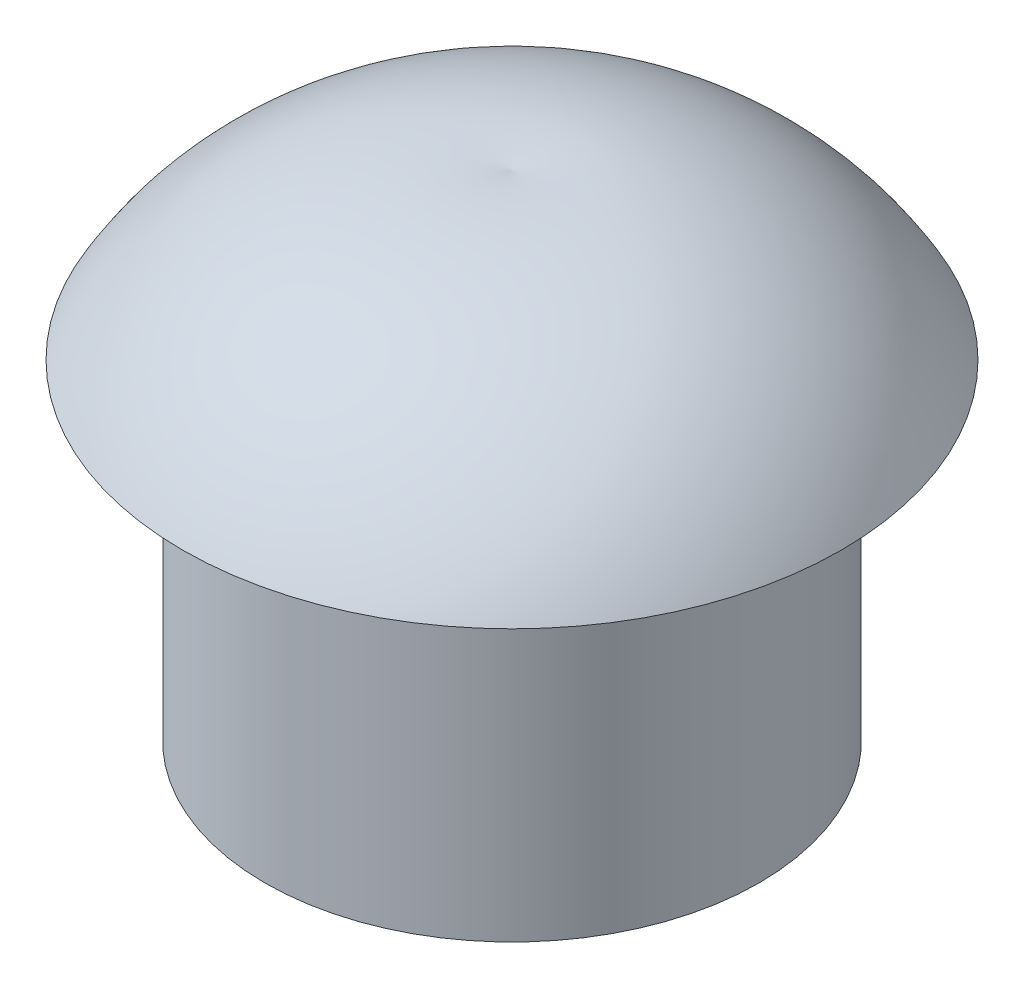
ISO-10303-21;
HEADER;
FILE_DESCRIPTION(('STEP AP214'),'2;1');
FILE_NAME('part.step','',(''),(''),'','','');
FILE_SCHEMA(('AUTOMOTIVE_DESIGN { 1 0 10303 214 1 1 1 1 }'));
ENDSEC;
DATA;
#1=APPLICATION_CONTEXT('core data for automotive mechanical design processes');
#2=APPLICATION_PROTOCOL_DEFINITION('international standard','automotive_design',2000,#1);
#3=PRODUCT_CONTEXT('',#1,'mechanical');
#4=PRODUCT('Part','Part','',(#3));
#5=PRODUCT_RELATED_PRODUCT_CATEGORY('part','',(#4));
#6=PRODUCT_DEFINITION_FORMATION('','',#4);
#7=PRODUCT_DEFINITION_CONTEXT('part definition',#1,'design');
#8=PRODUCT_DEFINITION('design','',#6,#7);
#9=PRODUCT_DEFINITION_SHAPE('','',#8);
#10=(LENGTH_UNIT() NAMED_UNIT(*) SI_UNIT(.MILLI.,.METRE.));
#11=(NAMED_UNIT(*) PLANE_ANGLE_UNIT() SI_UNIT($,.RADIAN.));
#12=(NAMED_UNIT(*) SI_UNIT($,.STERADIAN.) SOLID_ANGLE_UNIT());
#13=UNCERTAINTY_MEASURE_WITH_UNIT(LENGTH_MEASURE(1.E-05),#10,'distance_accuracy_value','');
#14=(GEOMETRIC_REPRESENTATION_CONTEXT(3) GLOBAL_UNCERTAINTY_ASSIGNED_CONTEXT((#13)) GLOBAL_UNIT_ASSIGNED_CONTEXT((#10,
#11,#12)) REPRESENTATION_CONTEXT('',''));
#15=CARTESIAN_POINT('',(0.,0.,0.));
#16=DIRECTION('',(0.,0.,1.));
#17=DIRECTION('',(1.,0.,0.));
#18=AXIS2_PLACEMENT_3D('',#15,#16,#17);
#19=CARTESIAN_POINT('',(0.,-2.,0.));
#20=DIRECTION('',(0.,1.,0.));
#21=DIRECTION('',(0.,0.,1.));
#22=AXIS2_PLACEMENT_3D('',#19,#20,#21);
#23=CYLINDRICAL_SURFACE('',#22,1.5);
#24=CARTESIAN_POINT('',(0.,-2.,0.));
#25=DIRECTION('',(0.,1.,0.));
#26=DIRECTION('',(0.,0.,1.));
#27=AXIS2_PLACEMENT_3D('',#24,#25,#26);
#28=CIRCLE('',#27,1.5);
#29=CARTESIAN_POINT('',(0.,-2.,1.5));
#30=VERTEX_POINT('',#29);
#31=EDGE_CURVE('E11',#30,#30,#28,.T.);
#32=ORIENTED_EDGE('',*,*,#31,.T.);
#33=EDGE_LOOP('',(#32));
#34=FACE_BOUND('',#33,.T.);
#35=CARTESIAN_POINT('',(0.,0.,0.));
#36=DIRECTION('',(0.,1.,0.));
#37=DIRECTION('',(0.,0.,1.));
#38=AXIS2_PLACEMENT_3D('',#35,#36,#37);
#39=CIRCLE('',#38,1.5);
#40=CARTESIAN_POINT('',(0.,0.,1.5));
#41=VERTEX_POINT('',#40);
#42=EDGE_CURVE('E37',#41,#41,#39,.T.);
#43=ORIENTED_EDGE('',*,*,#42,.F.);
#44=EDGE_LOOP('',(#43));
#45=FACE_BOUND('',#44,.T.);
#46=ADVANCED_FACE('F34',(#34,#45),#23,.T.);
#47=CARTESIAN_POINT('',(0.,-2.,0.));
#48=DIRECTION('',(0.,1.,0.));
#49=DIRECTION('',(0.,0.,1.));
#50=AXIS2_PLACEMENT_3D('',#47,#48,#49);
#51=PLANE('',#50);
#52=ORIENTED_EDGE('',*,*,#31,.F.);
#53=EDGE_LOOP('',(#52));
#54=FACE_BOUND('',#53,.T.);
#55=ADVANCED_FACE('F58',(#54),#51,.F.);
#56=CARTESIAN_POINT('',(0.,0.,0.));
#57=DIRECTION('',(0.,-1.,0.));
#58=DIRECTION('',(0.,0.,-1.));
#59=AXIS2_PLACEMENT_3D('',#56,#57,#58);
#60=PLANE('',#59);
#61=ORIENTED_EDGE('',*,*,#42,.T.);
#62=EDGE_LOOP('',(#61));
#63=FACE_BOUND('',#62,.T.);
#64=CARTESIAN_POINT('',(0.,0.,0.));
#65=DIRECTION('',(0.,-1.,0.));
#66=DIRECTION('',(0.,0.,-1.));
#67=AXIS2_PLACEMENT_3D('',#64,#65,#66);
#68=CIRCLE('',#67,2.);
#69=CARTESIAN_POINT('',(0.,0.,-2.));
#70=VERTEX_POINT('',#69);
#71=EDGE_CURVE('E50',#70,#70,#68,.T.);
#72=ORIENTED_EDGE('',*,*,#71,.T.);
#73=EDGE_LOOP('',(#72));
#74=FACE_BOUND('',#73,.T.);
#75=ADVANCED_FACE('F46',(#63,#74),#60,.T.);
#76=CARTESIAN_POINT('',(0.,-0.983239697419133,-0.258380151290434));
#77=DIRECTION('',(-1.,0.,0.));
#78=DIRECTION('',(0.,0.,-1.));
#79=AXIS2_PLACEMENT_3D('',#76,#77,#78);
#80=CIRCLE('',#79,2.);
#81=TRIMMED_CURVE('',#80,(PARAMETER_VALUE(-1.70034849394372)),
(PARAMETER_VALUE(1.70034849394372)),.T.,.PARAMETER.);
#82=CARTESIAN_POINT('',(0.,-0.983239697419133,0.));
#83=DIRECTION('',(0.,-1.,0.));
#84=AXIS1_PLACEMENT('',#82,#83);
#85=SURFACE_OF_REVOLUTION('',#81,#84);
#86=CARTESIAN_POINT('',(0.,1.,0.));
#87=VERTEX_POINT('',#86);
#88=VERTEX_LOOP('',#87);
#89=FACE_BOUND('',#88,.T.);
#90=ORIENTED_EDGE('',*,*,#71,.F.);
#91=EDGE_LOOP('',(#90));
#92=FACE_BOUND('',#91,.T.);
#93=ADVANCED_FACE('F43',(#89,#92),#85,.T.);
#94=CLOSED_SHELL('',(#46,#55,#75,#93));
#95=MANIFOLD_SOLID_BREP('B2',#94);
#96=ADVANCED_BREP_SHAPE_REPRESENTATION('',(#18,#95),#14);
#97=SHAPE_DEFINITION_REPRESENTATION(#9,#96);
ENDSEC;
END-ISO-10303-21;
